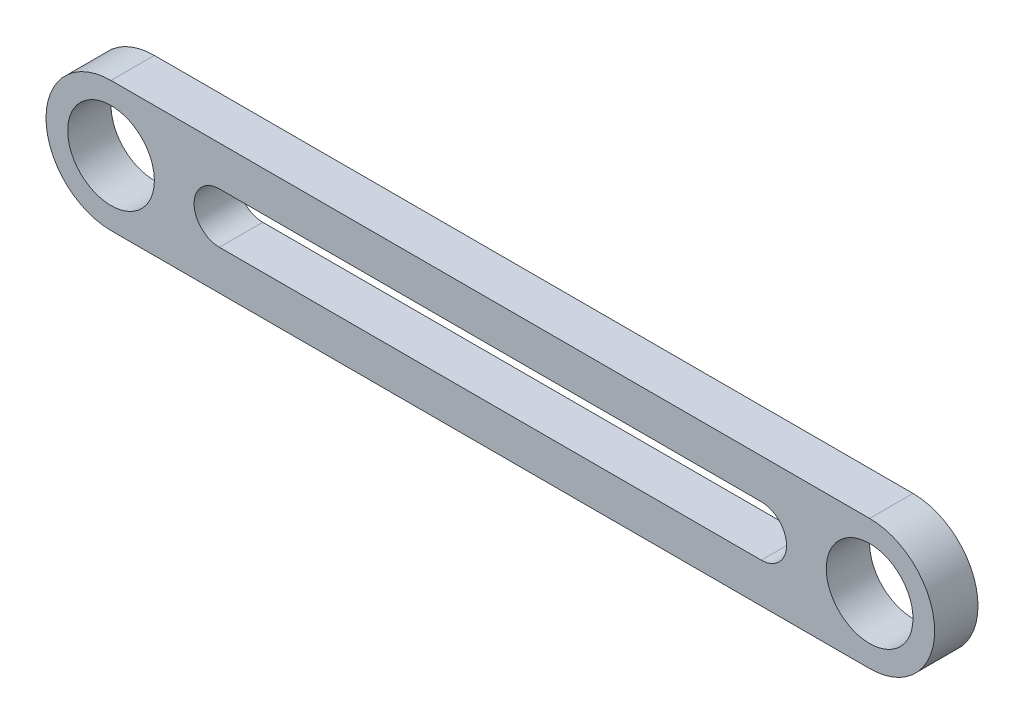
ISO-10303-21;
HEADER;
FILE_DESCRIPTION(('STEP AP214'),'2;1');
FILE_NAME('part.step','',(''),(''),'','','');
FILE_SCHEMA(('AUTOMOTIVE_DESIGN { 1 0 10303 214 1 1 1 1 }'));
ENDSEC;
DATA;
#1=APPLICATION_CONTEXT('core data for automotive mechanical design processes');
#2=APPLICATION_PROTOCOL_DEFINITION('international standard','automotive_design',2000,#1);
#3=PRODUCT_CONTEXT('',#1,'mechanical');
#4=PRODUCT('Part','Part','',(#3));
#5=PRODUCT_RELATED_PRODUCT_CATEGORY('part','',(#4));
#6=PRODUCT_DEFINITION_FORMATION('','',#4);
#7=PRODUCT_DEFINITION_CONTEXT('part definition',#1,'design');
#8=PRODUCT_DEFINITION('design','',#6,#7);
#9=PRODUCT_DEFINITION_SHAPE('','',#8);
#10=(LENGTH_UNIT() NAMED_UNIT(*) SI_UNIT(.MILLI.,.METRE.));
#11=(NAMED_UNIT(*) PLANE_ANGLE_UNIT() SI_UNIT($,.RADIAN.));
#12=(NAMED_UNIT(*) SI_UNIT($,.STERADIAN.) SOLID_ANGLE_UNIT());
#13=UNCERTAINTY_MEASURE_WITH_UNIT(LENGTH_MEASURE(1.E-05),#10,'distance_accuracy_value','');
#14=(GEOMETRIC_REPRESENTATION_CONTEXT(3) GLOBAL_UNCERTAINTY_ASSIGNED_CONTEXT((#13)) GLOBAL_UNIT_ASSIGNED_CONTEXT((#10,
#11,#12)) REPRESENTATION_CONTEXT('',''));
#15=CARTESIAN_POINT('',(0.,0.,0.));
#16=DIRECTION('',(0.,0.,1.));
#17=DIRECTION('',(1.,0.,0.));
#18=AXIS2_PLACEMENT_3D('',#15,#16,#17);
#19=CARTESIAN_POINT('',(0.,0.,6.));
#20=DIRECTION('',(0.,0.,1.));
#21=DIRECTION('',(1.,0.,0.));
#22=AXIS2_PLACEMENT_3D('',#19,#20,#21);
#23=PLANE('',#22);
#24=CARTESIAN_POINT('',(15.,0.,6.));
#25=DIRECTION('',(0.,0.,1.));
#26=DIRECTION('',(1.,0.,0.));
#27=AXIS2_PLACEMENT_3D('',#24,#25,#26);
#28=CIRCLE('',#27,3.5);
#29=CARTESIAN_POINT('',(15.,3.5,6.));
#30=VERTEX_POINT('',#29);
#31=CARTESIAN_POINT('',(15.,-3.5,6.));
#32=VERTEX_POINT('',#31);
#33=EDGE_CURVE('E49',#30,#32,#28,.T.);
#34=ORIENTED_EDGE('',*,*,#33,.F.);
#35=DIRECTION('',(-1.,0.,0.));
#36=VECTOR('',#35,1.);
#37=CARTESIAN_POINT('',(15.,3.5,6.));
#38=LINE('',#37,#36);
#39=CARTESIAN_POINT('',(90.,3.5,6.));
#40=VERTEX_POINT('',#39);
#41=EDGE_CURVE('E117',#40,#30,#38,.T.);
#42=ORIENTED_EDGE('',*,*,#41,.F.);
#43=CARTESIAN_POINT('',(90.,0.,6.));
#44=DIRECTION('',(0.,0.,1.));
#45=DIRECTION('',(1.,0.,0.));
#46=AXIS2_PLACEMENT_3D('',#43,#44,#45);
#47=CIRCLE('',#46,3.5);
#48=CARTESIAN_POINT('',(90.,-3.5,6.));
#49=VERTEX_POINT('',#48);
#50=EDGE_CURVE('E102',#49,#40,#47,.T.);
#51=ORIENTED_EDGE('',*,*,#50,.F.);
#52=DIRECTION('',(1.,0.,0.));
#53=VECTOR('',#52,1.);
#54=CARTESIAN_POINT('',(15.,-3.5,6.));
#55=LINE('',#54,#53);
#56=EDGE_CURVE('E111',#32,#49,#55,.T.);
#57=ORIENTED_EDGE('',*,*,#56,.F.);
#58=EDGE_LOOP('',(#34,#42,#51,#57));
#59=FACE_BOUND('',#58,.T.);
#60=CARTESIAN_POINT('',(0.,0.,6.));
#61=DIRECTION('',(0.,0.,1.));
#62=DIRECTION('',(1.,0.,0.));
#63=AXIS2_PLACEMENT_3D('',#60,#61,#62);
#64=CIRCLE('',#63,6.);
#65=CARTESIAN_POINT('',(6.,0.,6.));
#66=VERTEX_POINT('',#65);
#67=EDGE_CURVE('E133',#66,#66,#64,.T.);
#68=ORIENTED_EDGE('',*,*,#67,.F.);
#69=EDGE_LOOP('',(#68));
#70=FACE_BOUND('',#69,.T.);
#71=CARTESIAN_POINT('',(0.,0.,6.));
#72=DIRECTION('',(0.,0.,1.));
#73=DIRECTION('',(1.,0.,0.));
#74=AXIS2_PLACEMENT_3D('',#71,#72,#73);
#75=CIRCLE('',#74,9.);
#76=CARTESIAN_POINT('',(0.,9.,6.));
#77=VERTEX_POINT('',#76);
#78=CARTESIAN_POINT('',(0.,-9.,6.));
#79=VERTEX_POINT('',#78);
#80=EDGE_CURVE('E139',#77,#79,#75,.T.);
#81=ORIENTED_EDGE('',*,*,#80,.T.);
#82=DIRECTION('',(1.,0.,0.));
#83=VECTOR('',#82,1.);
#84=CARTESIAN_POINT('',(0.,-9.,6.));
#85=LINE('',#84,#83);
#86=CARTESIAN_POINT('',(105.,-9.,6.));
#87=VERTEX_POINT('',#86);
#88=EDGE_CURVE('E142',#79,#87,#85,.T.);
#89=ORIENTED_EDGE('',*,*,#88,.T.);
#90=CARTESIAN_POINT('',(105.,0.,6.));
#91=DIRECTION('',(0.,0.,1.));
#92=DIRECTION('',(1.,0.,0.));
#93=AXIS2_PLACEMENT_3D('',#90,#91,#92);
#94=CIRCLE('',#93,9.);
#95=CARTESIAN_POINT('',(105.,9.,6.));
#96=VERTEX_POINT('',#95);
#97=EDGE_CURVE('E145',#87,#96,#94,.T.);
#98=ORIENTED_EDGE('',*,*,#97,.T.);
#99=DIRECTION('',(-1.,0.,0.));
#100=VECTOR('',#99,1.);
#101=CARTESIAN_POINT('',(0.,9.,6.));
#102=LINE('',#101,#100);
#103=EDGE_CURVE('E147',#96,#77,#102,.T.);
#104=ORIENTED_EDGE('',*,*,#103,.T.);
#105=EDGE_LOOP('',(#81,#89,#98,#104));
#106=FACE_BOUND('',#105,.T.);
#107=CARTESIAN_POINT('',(105.,0.,6.));
#108=DIRECTION('',(0.,0.,1.));
#109=DIRECTION('',(1.,0.,0.));
#110=AXIS2_PLACEMENT_3D('',#107,#108,#109);
#111=CIRCLE('',#110,6.);
#112=CARTESIAN_POINT('',(111.,0.,6.));
#113=VERTEX_POINT('',#112);
#114=EDGE_CURVE('E127',#113,#113,#111,.T.);
#115=ORIENTED_EDGE('',*,*,#114,.F.);
#116=EDGE_LOOP('',(#115));
#117=FACE_BOUND('',#116,.T.);
#118=ADVANCED_FACE('F34',(#59,#70,#106,#117),#23,.T.);
#119=CARTESIAN_POINT('',(0.,0.,0.));
#120=DIRECTION('',(0.,0.,1.));
#121=DIRECTION('',(1.,0.,0.));
#122=AXIS2_PLACEMENT_3D('',#119,#120,#121);
#123=PLANE('',#122);
#124=DIRECTION('',(-1.,0.,0.));
#125=VECTOR('',#124,1.);
#126=CARTESIAN_POINT('',(0.,3.5,0.));
#127=LINE('',#126,#125);
#128=CARTESIAN_POINT('',(90.,3.5,0.));
#129=VERTEX_POINT('',#128);
#130=CARTESIAN_POINT('',(15.,3.5,0.));
#131=VERTEX_POINT('',#130);
#132=EDGE_CURVE('E42',#129,#131,#127,.T.);
#133=ORIENTED_EDGE('',*,*,#132,.T.);
#134=CARTESIAN_POINT('',(15.,0.,0.));
#135=DIRECTION('',(0.,0.,1.));
#136=DIRECTION('',(1.,0.,0.));
#137=AXIS2_PLACEMENT_3D('',#134,#135,#136);
#138=CIRCLE('',#137,3.5);
#139=CARTESIAN_POINT('',(15.,-3.5,0.));
#140=VERTEX_POINT('',#139);
#141=EDGE_CURVE('E11',#131,#140,#138,.T.);
#142=ORIENTED_EDGE('',*,*,#141,.T.);
#143=DIRECTION('',(1.,0.,0.));
#144=VECTOR('',#143,1.);
#145=CARTESIAN_POINT('',(0.,-3.5,0.));
#146=LINE('',#145,#144);
#147=CARTESIAN_POINT('',(90.,-3.5,0.));
#148=VERTEX_POINT('',#147);
#149=EDGE_CURVE('E168',#140,#148,#146,.T.);
#150=ORIENTED_EDGE('',*,*,#149,.T.);
#151=CARTESIAN_POINT('',(90.,0.,0.));
#152=DIRECTION('',(0.,0.,1.));
#153=DIRECTION('',(1.,0.,0.));
#154=AXIS2_PLACEMENT_3D('',#151,#152,#153);
#155=CIRCLE('',#154,3.5);
#156=EDGE_CURVE('E105',#148,#129,#155,.T.);
#157=ORIENTED_EDGE('',*,*,#156,.T.);
#158=EDGE_LOOP('',(#133,#142,#150,#157));
#159=FACE_BOUND('',#158,.T.);
#160=CARTESIAN_POINT('',(0.,0.,0.));
#161=DIRECTION('',(0.,0.,1.));
#162=DIRECTION('',(1.,0.,0.));
#163=AXIS2_PLACEMENT_3D('',#160,#161,#162);
#164=CIRCLE('',#163,9.);
#165=CARTESIAN_POINT('',(0.,9.,0.));
#166=VERTEX_POINT('',#165);
#167=CARTESIAN_POINT('',(0.,-9.,0.));
#168=VERTEX_POINT('',#167);
#169=EDGE_CURVE('E136',#166,#168,#164,.T.);
#170=ORIENTED_EDGE('',*,*,#169,.F.);
#171=DIRECTION('',(-1.,0.,0.));
#172=VECTOR('',#171,1.);
#173=CARTESIAN_POINT('',(0.,9.,0.));
#174=LINE('',#173,#172);
#175=CARTESIAN_POINT('',(105.,9.,0.));
#176=VERTEX_POINT('',#175);
#177=EDGE_CURVE('E143',#176,#166,#174,.T.);
#178=ORIENTED_EDGE('',*,*,#177,.F.);
#179=CARTESIAN_POINT('',(105.,0.,0.));
#180=DIRECTION('',(0.,0.,1.));
#181=DIRECTION('',(1.,0.,0.));
#182=AXIS2_PLACEMENT_3D('',#179,#180,#181);
#183=CIRCLE('',#182,9.);
#184=CARTESIAN_POINT('',(105.,-9.,0.));
#185=VERTEX_POINT('',#184);
#186=EDGE_CURVE('E154',#185,#176,#183,.T.);
#187=ORIENTED_EDGE('',*,*,#186,.F.);
#188=DIRECTION('',(1.,0.,0.));
#189=VECTOR('',#188,1.);
#190=CARTESIAN_POINT('',(0.,-9.,0.));
#191=LINE('',#190,#189);
#192=EDGE_CURVE('E152',#168,#185,#191,.T.);
#193=ORIENTED_EDGE('',*,*,#192,.F.);
#194=EDGE_LOOP('',(#170,#178,#187,#193));
#195=FACE_BOUND('',#194,.T.);
#196=CARTESIAN_POINT('',(0.,0.,0.));
#197=DIRECTION('',(0.,0.,1.));
#198=DIRECTION('',(1.,0.,0.));
#199=AXIS2_PLACEMENT_3D('',#196,#197,#198);
#200=CIRCLE('',#199,6.);
#201=CARTESIAN_POINT('',(6.,0.,0.));
#202=VERTEX_POINT('',#201);
#203=EDGE_CURVE('E130',#202,#202,#200,.T.);
#204=ORIENTED_EDGE('',*,*,#203,.T.);
#205=EDGE_LOOP('',(#204));
#206=FACE_BOUND('',#205,.T.);
#207=CARTESIAN_POINT('',(105.,0.,0.));
#208=DIRECTION('',(0.,0.,1.));
#209=DIRECTION('',(1.,0.,0.));
#210=AXIS2_PLACEMENT_3D('',#207,#208,#209);
#211=CIRCLE('',#210,6.);
#212=CARTESIAN_POINT('',(111.,0.,0.));
#213=VERTEX_POINT('',#212);
#214=EDGE_CURVE('E124',#213,#213,#211,.T.);
#215=ORIENTED_EDGE('',*,*,#214,.T.);
#216=EDGE_LOOP('',(#215));
#217=FACE_BOUND('',#216,.T.);
#218=ADVANCED_FACE('F172',(#159,#195,#206,#217),#123,.F.);
#219=CARTESIAN_POINT('',(0.,0.,6.));
#220=DIRECTION('',(0.,0.,-1.));
#221=DIRECTION('',(-1.,0.,0.));
#222=AXIS2_PLACEMENT_3D('',#219,#220,#221);
#223=CYLINDRICAL_SURFACE('',#222,9.);
#224=ORIENTED_EDGE('',*,*,#169,.T.);
#225=DIRECTION('',(0.,0.,-1.));
#226=VECTOR('',#225,1.);
#227=CARTESIAN_POINT('',(0.,-9.,6.));
#228=LINE('',#227,#226);
#229=EDGE_CURVE('E165',#79,#168,#228,.T.);
#230=ORIENTED_EDGE('',*,*,#229,.F.);
#231=ORIENTED_EDGE('',*,*,#80,.F.);
#232=DIRECTION('',(0.,0.,-1.));
#233=VECTOR('',#232,1.);
#234=CARTESIAN_POINT('',(0.,9.,6.));
#235=LINE('',#234,#233);
#236=EDGE_CURVE('E149',#77,#166,#235,.T.);
#237=ORIENTED_EDGE('',*,*,#236,.T.);
#238=EDGE_LOOP('',(#224,#230,#231,#237));
#239=FACE_BOUND('',#238,.T.);
#240=ADVANCED_FACE('F36',(#239),#223,.T.);
#241=CARTESIAN_POINT('',(0.,-9.,6.));
#242=DIRECTION('',(0.,1.,0.));
#243=DIRECTION('',(0.,0.,1.));
#244=AXIS2_PLACEMENT_3D('',#241,#242,#243);
#245=PLANE('',#244);
#246=ORIENTED_EDGE('',*,*,#192,.T.);
#247=DIRECTION('',(0.,0.,-1.));
#248=VECTOR('',#247,1.);
#249=CARTESIAN_POINT('',(105.,-9.,6.));
#250=LINE('',#249,#248);
#251=EDGE_CURVE('E162',#87,#185,#250,.T.);
#252=ORIENTED_EDGE('',*,*,#251,.F.);
#253=ORIENTED_EDGE('',*,*,#88,.F.);
#254=ORIENTED_EDGE('',*,*,#229,.T.);
#255=EDGE_LOOP('',(#246,#252,#253,#254));
#256=FACE_BOUND('',#255,.T.);
#257=ADVANCED_FACE('F204',(#256),#245,.F.);
#258=CARTESIAN_POINT('',(105.,0.,6.));
#259=DIRECTION('',(0.,0.,-1.));
#260=DIRECTION('',(-1.,0.,0.));
#261=AXIS2_PLACEMENT_3D('',#258,#259,#260);
#262=CYLINDRICAL_SURFACE('',#261,9.);
#263=ORIENTED_EDGE('',*,*,#186,.T.);
#264=DIRECTION('',(0.,0.,-1.));
#265=VECTOR('',#264,1.);
#266=CARTESIAN_POINT('',(105.,9.,6.));
#267=LINE('',#266,#265);
#268=EDGE_CURVE('E159',#96,#176,#267,.T.);
#269=ORIENTED_EDGE('',*,*,#268,.F.);
#270=ORIENTED_EDGE('',*,*,#97,.F.);
#271=ORIENTED_EDGE('',*,*,#251,.T.);
#272=EDGE_LOOP('',(#263,#269,#270,#271));
#273=FACE_BOUND('',#272,.T.);
#274=ADVANCED_FACE('F201',(#273),#262,.T.);
#275=CARTESIAN_POINT('',(0.,9.,6.));
#276=DIRECTION('',(0.,-1.,0.));
#277=DIRECTION('',(0.,0.,-1.));
#278=AXIS2_PLACEMENT_3D('',#275,#276,#277);
#279=PLANE('',#278);
#280=ORIENTED_EDGE('',*,*,#177,.T.);
#281=ORIENTED_EDGE('',*,*,#236,.F.);
#282=ORIENTED_EDGE('',*,*,#103,.F.);
#283=ORIENTED_EDGE('',*,*,#268,.T.);
#284=EDGE_LOOP('',(#280,#281,#282,#283));
#285=FACE_BOUND('',#284,.T.);
#286=ADVANCED_FACE('F198',(#285),#279,.F.);
#287=CARTESIAN_POINT('',(0.,0.,6.));
#288=DIRECTION('',(0.,0.,-1.));
#289=DIRECTION('',(-1.,0.,0.));
#290=AXIS2_PLACEMENT_3D('',#287,#288,#289);
#291=CYLINDRICAL_SURFACE('',#290,6.);
#292=ORIENTED_EDGE('',*,*,#67,.T.);
#293=EDGE_LOOP('',(#292));
#294=FACE_BOUND('',#293,.T.);
#295=ORIENTED_EDGE('',*,*,#203,.F.);
#296=EDGE_LOOP('',(#295));
#297=FACE_BOUND('',#296,.T.);
#298=ADVANCED_FACE('F186',(#294,#297),#291,.F.);
#299=CARTESIAN_POINT('',(105.,0.,6.));
#300=DIRECTION('',(0.,0.,-1.));
#301=DIRECTION('',(-1.,0.,0.));
#302=AXIS2_PLACEMENT_3D('',#299,#300,#301);
#303=CYLINDRICAL_SURFACE('',#302,6.);
#304=ORIENTED_EDGE('',*,*,#114,.T.);
#305=EDGE_LOOP('',(#304));
#306=FACE_BOUND('',#305,.T.);
#307=ORIENTED_EDGE('',*,*,#214,.F.);
#308=EDGE_LOOP('',(#307));
#309=FACE_BOUND('',#308,.T.);
#310=ADVANCED_FACE('F179',(#306,#309),#303,.F.);
#311=CARTESIAN_POINT('',(15.,0.,-4.));
#312=DIRECTION('',(0.,0.,1.));
#313=DIRECTION('',(1.,0.,0.));
#314=AXIS2_PLACEMENT_3D('',#311,#312,#313);
#315=CYLINDRICAL_SURFACE('',#314,3.5);
#316=DIRECTION('',(0.,0.,1.));
#317=VECTOR('',#316,1.);
#318=CARTESIAN_POINT('',(15.,3.5,-4.));
#319=LINE('',#318,#317);
#320=EDGE_CURVE('E122',#131,#30,#319,.T.);
#321=ORIENTED_EDGE('',*,*,#320,.T.);
#322=ORIENTED_EDGE('',*,*,#33,.T.);
#323=DIRECTION('',(0.,0.,1.));
#324=VECTOR('',#323,1.);
#325=CARTESIAN_POINT('',(15.,-3.5,-4.));
#326=LINE('',#325,#324);
#327=EDGE_CURVE('E108',#140,#32,#326,.T.);
#328=ORIENTED_EDGE('',*,*,#327,.F.);
#329=ORIENTED_EDGE('',*,*,#141,.F.);
#330=EDGE_LOOP('',(#321,#322,#328,#329));
#331=FACE_BOUND('',#330,.T.);
#332=ADVANCED_FACE('F177',(#331),#315,.F.);
#333=CARTESIAN_POINT('',(15.,3.5,-4.));
#334=DIRECTION('',(0.,1.,0.));
#335=DIRECTION('',(0.,0.,1.));
#336=AXIS2_PLACEMENT_3D('',#333,#334,#335);
#337=PLANE('',#336);
#338=DIRECTION('',(0.,0.,1.));
#339=VECTOR('',#338,1.);
#340=CARTESIAN_POINT('',(90.,3.5,-4.));
#341=LINE('',#340,#339);
#342=EDGE_CURVE('E107',#129,#40,#341,.T.);
#343=ORIENTED_EDGE('',*,*,#342,.T.);
#344=ORIENTED_EDGE('',*,*,#41,.T.);
#345=ORIENTED_EDGE('',*,*,#320,.F.);
#346=ORIENTED_EDGE('',*,*,#132,.F.);
#347=EDGE_LOOP('',(#343,#344,#345,#346));
#348=FACE_BOUND('',#347,.T.);
#349=ADVANCED_FACE('F176',(#348),#337,.F.);
#350=CARTESIAN_POINT('',(90.,0.,-4.));
#351=DIRECTION('',(0.,0.,1.));
#352=DIRECTION('',(1.,0.,0.));
#353=AXIS2_PLACEMENT_3D('',#350,#351,#352);
#354=CYLINDRICAL_SURFACE('',#353,3.5);
#355=DIRECTION('',(0.,0.,1.));
#356=VECTOR('',#355,1.);
#357=CARTESIAN_POINT('',(90.,-3.5,-4.));
#358=LINE('',#357,#356);
#359=EDGE_CURVE('E57',#148,#49,#358,.T.);
#360=ORIENTED_EDGE('',*,*,#359,.T.);
#361=ORIENTED_EDGE('',*,*,#50,.T.);
#362=ORIENTED_EDGE('',*,*,#342,.F.);
#363=ORIENTED_EDGE('',*,*,#156,.F.);
#364=EDGE_LOOP('',(#360,#361,#362,#363));
#365=FACE_BOUND('',#364,.T.);
#366=ADVANCED_FACE('F99',(#365),#354,.F.);
#367=CARTESIAN_POINT('',(15.,-3.5,-4.));
#368=DIRECTION('',(0.,-1.,0.));
#369=DIRECTION('',(0.,0.,-1.));
#370=AXIS2_PLACEMENT_3D('',#367,#368,#369);
#371=PLANE('',#370);
#372=ORIENTED_EDGE('',*,*,#327,.T.);
#373=ORIENTED_EDGE('',*,*,#56,.T.);
#374=ORIENTED_EDGE('',*,*,#359,.F.);
#375=ORIENTED_EDGE('',*,*,#149,.F.);
#376=EDGE_LOOP('',(#372,#373,#374,#375));
#377=FACE_BOUND('',#376,.T.);
#378=ADVANCED_FACE('F112',(#377),#371,.F.);
#379=CLOSED_SHELL('',(#118,#218,#240,#257,#274,#286,#298,#310,#332,#349,#366,#378));
#380=MANIFOLD_SOLID_BREP('B2',#379);
#381=ADVANCED_BREP_SHAPE_REPRESENTATION('',(#18,#380),#14);
#382=SHAPE_DEFINITION_REPRESENTATION(#9,#381);
ENDSEC;
END-ISO-10303-21;
